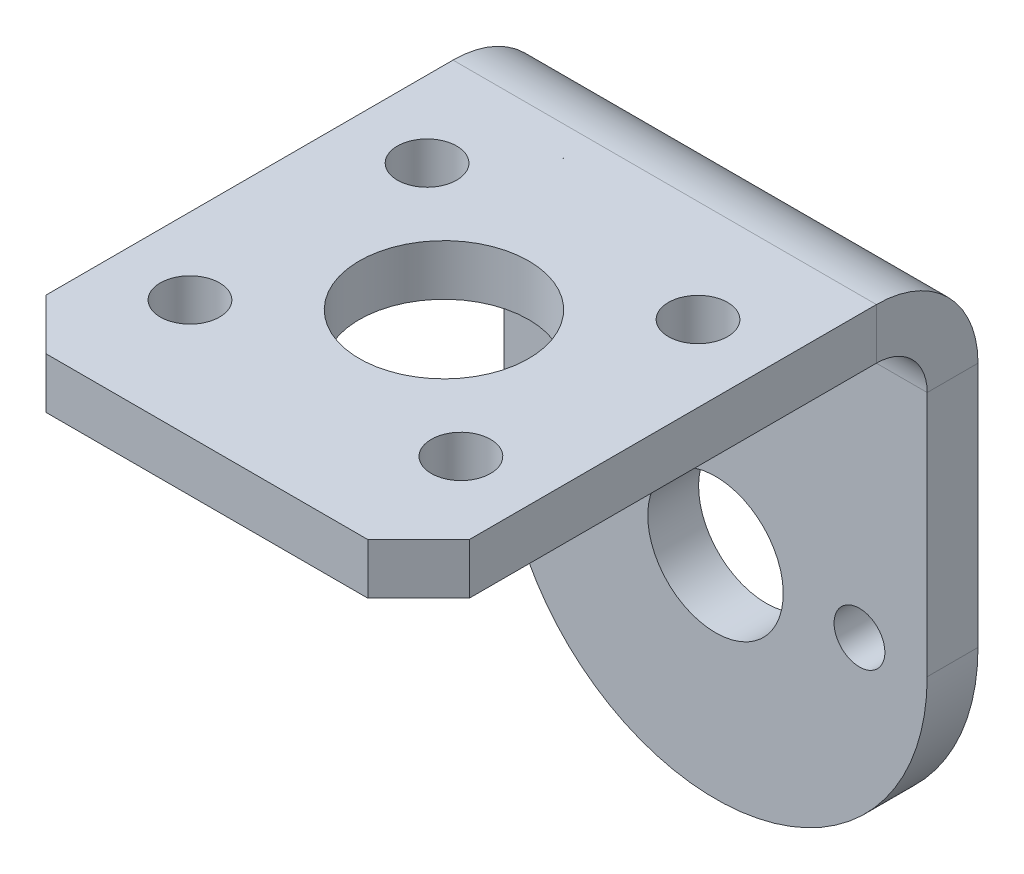
ISO-10303-21;
HEADER;
FILE_DESCRIPTION(('STEP AP214'),'2;1');
FILE_NAME('part.step','',(''),(''),'','','');
FILE_SCHEMA(('AUTOMOTIVE_DESIGN { 1 0 10303 214 1 1 1 1 }'));
ENDSEC;
DATA;
#1=APPLICATION_CONTEXT('core data for automotive mechanical design processes');
#2=APPLICATION_PROTOCOL_DEFINITION('international standard','automotive_design',2000,#1);
#3=PRODUCT_CONTEXT('',#1,'mechanical');
#4=PRODUCT('Part','Part','',(#3));
#5=PRODUCT_RELATED_PRODUCT_CATEGORY('part','',(#4));
#6=PRODUCT_DEFINITION_FORMATION('','',#4);
#7=PRODUCT_DEFINITION_CONTEXT('part definition',#1,'design');
#8=PRODUCT_DEFINITION('design','',#6,#7);
#9=PRODUCT_DEFINITION_SHAPE('','',#8);
#10=(LENGTH_UNIT() NAMED_UNIT(*) SI_UNIT(.MILLI.,.METRE.));
#11=(NAMED_UNIT(*) PLANE_ANGLE_UNIT() SI_UNIT($,.RADIAN.));
#12=(NAMED_UNIT(*) SI_UNIT($,.STERADIAN.) SOLID_ANGLE_UNIT());
#13=UNCERTAINTY_MEASURE_WITH_UNIT(LENGTH_MEASURE(1.E-05),#10,'distance_accuracy_value','');
#14=(GEOMETRIC_REPRESENTATION_CONTEXT(3) GLOBAL_UNCERTAINTY_ASSIGNED_CONTEXT((#13)) GLOBAL_UNIT_ASSIGNED_CONTEXT((#10,
#11,#12)) REPRESENTATION_CONTEXT('',''));
#15=CARTESIAN_POINT('',(0.,0.,0.));
#16=DIRECTION('',(0.,0.,1.));
#17=DIRECTION('',(1.,0.,0.));
#18=AXIS2_PLACEMENT_3D('',#15,#16,#17);
#19=CARTESIAN_POINT('',(30.0870470611948,35.2072130891019,-10.4479249054658));
#20=DIRECTION('',(0.,-1.,0.));
#21=DIRECTION('',(1.,0.,0.));
#22=AXIS2_PLACEMENT_3D('',#19,#20,#21);
#23=PLANE('',#22);
#24=CARTESIAN_POINT('',(30.0870470611941,35.2072130891018,19.034079934123));
#25=DIRECTION('',(0.,1.,0.));
#26=DIRECTION('',(0.,0.,-1.));
#27=AXIS2_PLACEMENT_3D('',#24,#25,#26);
#28=CIRCLE('',#27,4.99999999999994);
#29=CARTESIAN_POINT('',(30.0870470611943,35.2072130891018,14.034079934123));
#30=VERTEX_POINT('',#29);
#31=EDGE_CURVE('E12',#30,#30,#28,.T.);
#32=ORIENTED_EDGE('',*,*,#31,.T.);
#33=EDGE_LOOP('',(#32));
#34=FACE_BOUND('',#33,.T.);
#35=CARTESIAN_POINT('',(22.0870470611939,35.2072130891018,26.0340799341227));
#36=DIRECTION('',(0.,1.,0.));
#37=DIRECTION('',(0.,0.,-1.));
#38=AXIS2_PLACEMENT_3D('',#35,#36,#37);
#39=CIRCLE('',#38,1.75);
#40=CARTESIAN_POINT('',(22.0870470611939,35.2072130891018,24.2840799341228));
#41=VERTEX_POINT('',#40);
#42=EDGE_CURVE('E30',#41,#41,#39,.T.);
#43=ORIENTED_EDGE('',*,*,#42,.T.);
#44=EDGE_LOOP('',(#43));
#45=FACE_BOUND('',#44,.T.);
#46=CARTESIAN_POINT('',(22.0870470611942,35.2072130891018,12.0340799341227));
#47=DIRECTION('',(0.,1.,0.));
#48=DIRECTION('',(0.,0.,-1.));
#49=AXIS2_PLACEMENT_3D('',#46,#47,#48);
#50=CIRCLE('',#49,1.75000000000006);
#51=CARTESIAN_POINT('',(22.0870470611943,35.2072130891018,10.2840799341228));
#52=VERTEX_POINT('',#51);
#53=EDGE_CURVE('E344',#52,#52,#50,.T.);
#54=ORIENTED_EDGE('',*,*,#53,.T.);
#55=EDGE_LOOP('',(#54));
#56=FACE_BOUND('',#55,.T.);
#57=CARTESIAN_POINT('',(38.0870470611939,35.2072130891018,26.0340799341232));
#58=DIRECTION('',(0.,1.,0.));
#59=DIRECTION('',(0.,0.,-1.));
#60=AXIS2_PLACEMENT_3D('',#57,#58,#59);
#61=CIRCLE('',#60,1.74999999999994);
#62=CARTESIAN_POINT('',(38.0870470611939,35.2072130891018,24.2840799341233));
#63=VERTEX_POINT('',#62);
#64=EDGE_CURVE('E354',#63,#63,#61,.T.);
#65=ORIENTED_EDGE('',*,*,#64,.T.);
#66=EDGE_LOOP('',(#65));
#67=FACE_BOUND('',#66,.T.);
#68=CARTESIAN_POINT('',(38.0870470611943,35.2072130891018,12.0340799341233));
#69=DIRECTION('',(0.,1.,0.));
#70=DIRECTION('',(0.,0.,-1.));
#71=AXIS2_PLACEMENT_3D('',#68,#69,#70);
#72=CIRCLE('',#71,1.74999999999994);
#73=CARTESIAN_POINT('',(38.0870470611944,35.2072130891018,10.2840799341233));
#74=VERTEX_POINT('',#73);
#75=EDGE_CURVE('E357',#74,#74,#72,.T.);
#76=ORIENTED_EDGE('',*,*,#75,.T.);
#77=EDGE_LOOP('',(#76));
#78=FACE_BOUND('',#77,.T.);
#79=DIRECTION('',(1.,0.,0.));
#80=VECTOR('',#79,1.);
#81=CARTESIAN_POINT('',(17.5870470611945,35.2072130891019,5.99999999999999));
#82=LINE('',#81,#80);
#83=CARTESIAN_POINT('',(17.5870470611945,35.2072130891019,5.99999999999999));
#84=VERTEX_POINT('',#83);
#85=CARTESIAN_POINT('',(42.5870470611946,35.2072130891019,6.));
#86=VERTEX_POINT('',#85);
#87=EDGE_CURVE('E323',#84,#86,#82,.T.);
#88=ORIENTED_EDGE('',*,*,#87,.T.);
#89=DIRECTION('',(0.,0.,-1.));
#90=VECTOR('',#89,1.);
#91=CARTESIAN_POINT('',(42.5870470611939,35.2072130891018,30.0340799341233));
#92=LINE('',#91,#90);
#93=CARTESIAN_POINT('',(42.5870470611939,35.2072130891018,30.0340799341233));
#94=VERTEX_POINT('',#93);
#95=EDGE_CURVE('E175',#94,#86,#92,.T.);
#96=ORIENTED_EDGE('',*,*,#95,.F.);
#97=DIRECTION('',(0.707106781186582,0.,-0.707106781186513));
#98=VECTOR('',#97,1.);
#99=CARTESIAN_POINT('',(39.5870470611937,35.2072130891018,33.0340799341233));
#100=LINE('',#99,#98);
#101=CARTESIAN_POINT('',(39.5870470611937,35.2072130891018,33.0340799341233));
#102=VERTEX_POINT('',#101);
#103=EDGE_CURVE('E382',#102,#94,#100,.T.);
#104=ORIENTED_EDGE('',*,*,#103,.F.);
#105=DIRECTION('',(1.,0.,0.));
#106=VECTOR('',#105,1.);
#107=CARTESIAN_POINT('',(20.5870470611937,35.2072130891018,33.0340799341228));
#108=LINE('',#107,#106);
#109=CARTESIAN_POINT('',(20.5870470611937,35.2072130891018,33.0340799341228));
#110=VERTEX_POINT('',#109);
#111=EDGE_CURVE('E374',#110,#102,#108,.T.);
#112=ORIENTED_EDGE('',*,*,#111,.F.);
#113=DIRECTION('',(0.707106781186507,0.,0.707106781186588));
#114=VECTOR('',#113,1.);
#115=CARTESIAN_POINT('',(17.5870470611939,35.2072130891018,30.0340799341226));
#116=LINE('',#115,#114);
#117=CARTESIAN_POINT('',(17.5870470611939,35.2072130891018,30.0340799341226));
#118=VERTEX_POINT('',#117);
#119=EDGE_CURVE('E365',#118,#110,#116,.T.);
#120=ORIENTED_EDGE('',*,*,#119,.F.);
#121=DIRECTION('',(0.,0.,1.));
#122=VECTOR('',#121,1.);
#123=CARTESIAN_POINT('',(17.5870470611945,35.2072130891019,5.99999999999999));
#124=LINE('',#123,#122);
#125=EDGE_CURVE('E276',#84,#118,#124,.T.);
#126=ORIENTED_EDGE('',*,*,#125,.F.);
#127=EDGE_LOOP('',(#88,#96,#104,#112,#120,#126));
#128=FACE_BOUND('',#127,.T.);
#129=ADVANCED_FACE('F21',(#34,#45,#56,#67,#78,#128),#23,.T.);
#130=CARTESIAN_POINT('',(30.0870470611941,38.2072130891018,19.034079934123));
#131=DIRECTION('',(0.,1.,0.));
#132=DIRECTION('',(0.,0.,-1.));
#133=AXIS2_PLACEMENT_3D('',#130,#131,#132);
#134=CYLINDRICAL_SURFACE('',#133,4.99999999999994);
#135=CARTESIAN_POINT('',(30.0870470611941,38.2072130891018,19.034079934123));
#136=DIRECTION('',(0.,-1.,0.));
#137=DIRECTION('',(0.,0.,-1.));
#138=AXIS2_PLACEMENT_3D('',#135,#136,#137);
#139=CIRCLE('',#138,4.99999999999994);
#140=CARTESIAN_POINT('',(30.0870470611943,38.2072130891019,14.034079934123));
#141=VERTEX_POINT('',#140);
#142=EDGE_CURVE('E156',#141,#141,#139,.T.);
#143=ORIENTED_EDGE('',*,*,#142,.F.);
#144=EDGE_LOOP('',(#143));
#145=FACE_BOUND('',#144,.T.);
#146=ORIENTED_EDGE('',*,*,#31,.F.);
#147=EDGE_LOOP('',(#146));
#148=FACE_BOUND('',#147,.T.);
#149=ADVANCED_FACE('F501',(#145,#148),#134,.F.);
#150=CARTESIAN_POINT('',(22.0870470611939,38.2072130891018,26.0340799341227));
#151=DIRECTION('',(0.,1.,0.));
#152=DIRECTION('',(0.,0.,-1.));
#153=AXIS2_PLACEMENT_3D('',#150,#151,#152);
#154=CYLINDRICAL_SURFACE('',#153,1.75);
#155=CARTESIAN_POINT('',(22.0870470611939,38.2072130891018,26.0340799341227));
#156=DIRECTION('',(0.,-1.,0.));
#157=DIRECTION('',(0.,0.,-1.));
#158=AXIS2_PLACEMENT_3D('',#155,#156,#157);
#159=CIRCLE('',#158,1.75);
#160=CARTESIAN_POINT('',(22.0870470611939,38.2072130891018,24.2840799341228));
#161=VERTEX_POINT('',#160);
#162=EDGE_CURVE('E292',#161,#161,#159,.T.);
#163=ORIENTED_EDGE('',*,*,#162,.F.);
#164=EDGE_LOOP('',(#163));
#165=FACE_BOUND('',#164,.T.);
#166=ORIENTED_EDGE('',*,*,#42,.F.);
#167=EDGE_LOOP('',(#166));
#168=FACE_BOUND('',#167,.T.);
#169=ADVANCED_FACE('F529',(#165,#168),#154,.F.);
#170=CARTESIAN_POINT('',(22.0870470611942,38.2072130891019,12.0340799341227));
#171=DIRECTION('',(0.,1.,0.));
#172=DIRECTION('',(0.,0.,-1.));
#173=AXIS2_PLACEMENT_3D('',#170,#171,#172);
#174=CYLINDRICAL_SURFACE('',#173,1.75000000000006);
#175=CARTESIAN_POINT('',(22.0870470611942,38.2072130891019,12.0340799341227));
#176=DIRECTION('',(0.,-1.,0.));
#177=DIRECTION('',(0.,0.,-1.));
#178=AXIS2_PLACEMENT_3D('',#175,#176,#177);
#179=CIRCLE('',#178,1.75000000000006);
#180=CARTESIAN_POINT('',(22.0870470611943,38.2072130891019,10.2840799341228));
#181=VERTEX_POINT('',#180);
#182=EDGE_CURVE('E289',#181,#181,#179,.T.);
#183=ORIENTED_EDGE('',*,*,#182,.F.);
#184=EDGE_LOOP('',(#183));
#185=FACE_BOUND('',#184,.T.);
#186=ORIENTED_EDGE('',*,*,#53,.F.);
#187=EDGE_LOOP('',(#186));
#188=FACE_BOUND('',#187,.T.);
#189=ADVANCED_FACE('F495',(#185,#188),#174,.F.);
#190=CARTESIAN_POINT('',(38.0870470611939,38.2072130891018,26.0340799341232));
#191=DIRECTION('',(0.,1.,0.));
#192=DIRECTION('',(0.,0.,-1.));
#193=AXIS2_PLACEMENT_3D('',#190,#191,#192);
#194=CYLINDRICAL_SURFACE('',#193,1.74999999999994);
#195=CARTESIAN_POINT('',(38.0870470611939,38.2072130891018,26.0340799341232));
#196=DIRECTION('',(0.,-1.,0.));
#197=DIRECTION('',(0.,0.,-1.));
#198=AXIS2_PLACEMENT_3D('',#195,#196,#197);
#199=CIRCLE('',#198,1.74999999999994);
#200=CARTESIAN_POINT('',(38.0870470611939,38.2072130891018,24.2840799341233));
#201=VERTEX_POINT('',#200);
#202=EDGE_CURVE('E277',#201,#201,#199,.T.);
#203=ORIENTED_EDGE('',*,*,#202,.F.);
#204=EDGE_LOOP('',(#203));
#205=FACE_BOUND('',#204,.T.);
#206=ORIENTED_EDGE('',*,*,#64,.F.);
#207=EDGE_LOOP('',(#206));
#208=FACE_BOUND('',#207,.T.);
#209=ADVANCED_FACE('F491',(#205,#208),#194,.F.);
#210=CARTESIAN_POINT('',(38.0870470611943,38.2072130891019,12.0340799341233));
#211=DIRECTION('',(0.,1.,0.));
#212=DIRECTION('',(0.,0.,-1.));
#213=AXIS2_PLACEMENT_3D('',#210,#211,#212);
#214=CYLINDRICAL_SURFACE('',#213,1.74999999999994);
#215=CARTESIAN_POINT('',(38.0870470611943,38.2072130891019,12.0340799341233));
#216=DIRECTION('',(0.,-1.,0.));
#217=DIRECTION('',(0.,0.,-1.));
#218=AXIS2_PLACEMENT_3D('',#215,#216,#217);
#219=CIRCLE('',#218,1.74999999999994);
#220=CARTESIAN_POINT('',(38.0870470611944,38.2072130891019,10.2840799341233));
#221=VERTEX_POINT('',#220);
#222=EDGE_CURVE('E272',#221,#221,#219,.T.);
#223=ORIENTED_EDGE('',*,*,#222,.F.);
#224=EDGE_LOOP('',(#223));
#225=FACE_BOUND('',#224,.T.);
#226=ORIENTED_EDGE('',*,*,#75,.F.);
#227=EDGE_LOOP('',(#226));
#228=FACE_BOUND('',#227,.T.);
#229=ADVANCED_FACE('F494',(#225,#228),#214,.F.);
#230=CARTESIAN_POINT('',(17.5870470611939,38.2072130891018,30.0340799341226));
#231=DIRECTION('',(-0.707106781186588,0.,0.707106781186507));
#232=DIRECTION('',(0.,-1.,0.));
#233=AXIS2_PLACEMENT_3D('',#230,#231,#232);
#234=PLANE('',#233);
#235=ORIENTED_EDGE('',*,*,#119,.T.);
#236=DIRECTION('',(0.,-1.,0.));
#237=VECTOR('',#236,1.);
#238=CARTESIAN_POINT('',(20.5870470611937,38.2072130891018,33.0340799341228));
#239=LINE('',#238,#237);
#240=CARTESIAN_POINT('',(20.5870470611937,38.2072130891018,33.0340799341228));
#241=VERTEX_POINT('',#240);
#242=EDGE_CURVE('E369',#241,#110,#239,.T.);
#243=ORIENTED_EDGE('',*,*,#242,.F.);
#244=DIRECTION('',(-0.707106781186507,0.,-0.707106781186588));
#245=VECTOR('',#244,1.);
#246=CARTESIAN_POINT('',(20.5870470611937,38.2072130891018,33.0340799341228));
#247=LINE('',#246,#245);
#248=CARTESIAN_POINT('',(17.5870470611939,38.2072130891018,30.0340799341226));
#249=VERTEX_POINT('',#248);
#250=EDGE_CURVE('E479',#241,#249,#247,.T.);
#251=ORIENTED_EDGE('',*,*,#250,.T.);
#252=DIRECTION('',(0.,-1.,0.));
#253=VECTOR('',#252,1.);
#254=CARTESIAN_POINT('',(17.5870470611939,38.2072130891018,30.0340799341226));
#255=LINE('',#254,#253);
#256=EDGE_CURVE('E438',#249,#118,#255,.T.);
#257=ORIENTED_EDGE('',*,*,#256,.T.);
#258=EDGE_LOOP('',(#235,#243,#251,#257));
#259=FACE_BOUND('',#258,.T.);
#260=ADVANCED_FACE('F514',(#259),#234,.T.);
#261=CARTESIAN_POINT('',(20.5870470611937,38.2072130891018,33.0340799341228));
#262=DIRECTION('',(0.,0.,1.));
#263=DIRECTION('',(0.,-1.,0.));
#264=AXIS2_PLACEMENT_3D('',#261,#262,#263);
#265=PLANE('',#264);
#266=ORIENTED_EDGE('',*,*,#111,.T.);
#267=DIRECTION('',(0.,-1.,0.));
#268=VECTOR('',#267,1.);
#269=CARTESIAN_POINT('',(39.5870470611937,38.2072130891018,33.0340799341233));
#270=LINE('',#269,#268);
#271=CARTESIAN_POINT('',(39.5870470611937,38.2072130891018,33.0340799341233));
#272=VERTEX_POINT('',#271);
#273=EDGE_CURVE('E378',#272,#102,#270,.T.);
#274=ORIENTED_EDGE('',*,*,#273,.F.);
#275=DIRECTION('',(-1.,0.,0.));
#276=VECTOR('',#275,1.);
#277=CARTESIAN_POINT('',(39.5870470611937,38.2072130891018,33.0340799341233));
#278=LINE('',#277,#276);
#279=EDGE_CURVE('E481',#272,#241,#278,.T.);
#280=ORIENTED_EDGE('',*,*,#279,.T.);
#281=ORIENTED_EDGE('',*,*,#242,.T.);
#282=EDGE_LOOP('',(#266,#274,#280,#281));
#283=FACE_BOUND('',#282,.T.);
#284=ADVANCED_FACE('F509',(#283),#265,.T.);
#285=CARTESIAN_POINT('',(39.5870470611937,38.2072130891018,33.0340799341233));
#286=DIRECTION('',(0.707106781186513,0.,0.707106781186582));
#287=DIRECTION('',(0.,1.,0.));
#288=AXIS2_PLACEMENT_3D('',#285,#286,#287);
#289=PLANE('',#288);
#290=ORIENTED_EDGE('',*,*,#103,.T.);
#291=DIRECTION('',(0.,-1.,0.));
#292=VECTOR('',#291,1.);
#293=CARTESIAN_POINT('',(42.5870470611939,38.2072130891018,30.0340799341233));
#294=LINE('',#293,#292);
#295=CARTESIAN_POINT('',(42.5870470611939,38.2072130891018,30.0340799341233));
#296=VERTEX_POINT('',#295);
#297=EDGE_CURVE('E390',#296,#94,#294,.T.);
#298=ORIENTED_EDGE('',*,*,#297,.F.);
#299=DIRECTION('',(-0.707106781186582,0.,0.707106781186513));
#300=VECTOR('',#299,1.);
#301=CARTESIAN_POINT('',(42.5870470611939,38.2072130891018,30.0340799341233));
#302=LINE('',#301,#300);
#303=EDGE_CURVE('E151',#296,#272,#302,.T.);
#304=ORIENTED_EDGE('',*,*,#303,.T.);
#305=ORIENTED_EDGE('',*,*,#273,.T.);
#306=EDGE_LOOP('',(#290,#298,#304,#305));
#307=FACE_BOUND('',#306,.T.);
#308=ADVANCED_FACE('F513',(#307),#289,.T.);
#309=CARTESIAN_POINT('',(42.587047061194,38.2072130891019,2.60708911712294));
#310=DIRECTION('',(1.,0.,0.));
#311=DIRECTION('',(0.,1.,0.));
#312=AXIS2_PLACEMENT_3D('',#309,#310,#311);
#313=PLANE('',#312);
#314=DIRECTION('',(0.,1.,0.));
#315=VECTOR('',#314,1.);
#316=CARTESIAN_POINT('',(42.5870470611946,35.2072130891019,6.));
#317=LINE('',#316,#315);
#318=CARTESIAN_POINT('',(42.5870470611946,38.2072130891019,6.));
#319=VERTEX_POINT('',#318);
#320=EDGE_CURVE('E172',#86,#319,#317,.T.);
#321=ORIENTED_EDGE('',*,*,#320,.T.);
#322=DIRECTION('',(0.,0.,1.));
#323=VECTOR('',#322,1.);
#324=CARTESIAN_POINT('',(42.5870470611946,38.2072130891019,6.));
#325=LINE('',#324,#323);
#326=EDGE_CURVE('E143',#319,#296,#325,.T.);
#327=ORIENTED_EDGE('',*,*,#326,.T.);
#328=ORIENTED_EDGE('',*,*,#297,.T.);
#329=ORIENTED_EDGE('',*,*,#95,.T.);
#330=EDGE_LOOP('',(#321,#327,#328,#329));
#331=FACE_BOUND('',#330,.T.);
#332=ADVANCED_FACE('F173',(#331),#313,.T.);
#333=CARTESIAN_POINT('',(17.5870470611951,38.2072130891019,-15.3199016998773));
#334=DIRECTION('',(-1.,0.,0.));
#335=DIRECTION('',(0.,-1.,0.));
#336=AXIS2_PLACEMENT_3D('',#333,#334,#335);
#337=PLANE('',#336);
#338=DIRECTION('',(0.,-1.,0.));
#339=VECTOR('',#338,1.);
#340=CARTESIAN_POINT('',(17.5870470611945,38.2072130891019,5.99999999999999));
#341=LINE('',#340,#339);
#342=CARTESIAN_POINT('',(17.5870470611945,38.2072130891019,5.99999999999999));
#343=VERTEX_POINT('',#342);
#344=EDGE_CURVE('E169',#343,#84,#341,.T.);
#345=ORIENTED_EDGE('',*,*,#344,.T.);
#346=ORIENTED_EDGE('',*,*,#125,.T.);
#347=ORIENTED_EDGE('',*,*,#256,.F.);
#348=DIRECTION('',(0.,0.,-1.));
#349=VECTOR('',#348,1.);
#350=CARTESIAN_POINT('',(17.5870470611939,38.2072130891018,30.0340799341226));
#351=LINE('',#350,#349);
#352=EDGE_CURVE('E430',#249,#343,#351,.T.);
#353=ORIENTED_EDGE('',*,*,#352,.T.);
#354=EDGE_LOOP('',(#345,#346,#347,#353));
#355=FACE_BOUND('',#354,.T.);
#356=ADVANCED_FACE('F449',(#355),#337,.T.);
#357=CARTESIAN_POINT('',(30.0870470611948,38.2072130891019,-10.4479249054658));
#358=DIRECTION('',(0.,1.,0.));
#359=DIRECTION('',(1.,0.,0.));
#360=AXIS2_PLACEMENT_3D('',#357,#358,#359);
#361=PLANE('',#360);
#362=ORIENTED_EDGE('',*,*,#222,.T.);
#363=EDGE_LOOP('',(#362));
#364=FACE_BOUND('',#363,.T.);
#365=ORIENTED_EDGE('',*,*,#202,.T.);
#366=EDGE_LOOP('',(#365));
#367=FACE_BOUND('',#366,.T.);
#368=ORIENTED_EDGE('',*,*,#182,.T.);
#369=EDGE_LOOP('',(#368));
#370=FACE_BOUND('',#369,.T.);
#371=ORIENTED_EDGE('',*,*,#162,.T.);
#372=EDGE_LOOP('',(#371));
#373=FACE_BOUND('',#372,.T.);
#374=ORIENTED_EDGE('',*,*,#142,.T.);
#375=EDGE_LOOP('',(#374));
#376=FACE_BOUND('',#375,.T.);
#377=DIRECTION('',(-1.,0.,0.));
#378=VECTOR('',#377,1.);
#379=CARTESIAN_POINT('',(42.5870470611946,38.2072130891019,6.));
#380=LINE('',#379,#378);
#381=EDGE_CURVE('E147',#319,#343,#380,.T.);
#382=ORIENTED_EDGE('',*,*,#381,.T.);
#383=ORIENTED_EDGE('',*,*,#352,.F.);
#384=ORIENTED_EDGE('',*,*,#250,.F.);
#385=ORIENTED_EDGE('',*,*,#279,.F.);
#386=ORIENTED_EDGE('',*,*,#303,.F.);
#387=ORIENTED_EDGE('',*,*,#326,.F.);
#388=EDGE_LOOP('',(#382,#383,#384,#385,#386,#387));
#389=FACE_BOUND('',#388,.T.);
#390=ADVANCED_FACE('F145',(#364,#367,#370,#373,#376,#389),#361,.T.);
#391=CARTESIAN_POINT('',(30.0870470611951,17.6731515209788,0.));
#392=DIRECTION('',(0.,0.,1.));
#393=DIRECTION('',(-1.,0.,0.));
#394=AXIS2_PLACEMENT_3D('',#391,#392,#393);
#395=CYLINDRICAL_SURFACE('',#394,12.5);
#396=CARTESIAN_POINT('',(30.0870470611951,17.6731515209788,3.));
#397=DIRECTION('',(0.,0.,-1.));
#398=DIRECTION('',(-1.,0.,0.));
#399=AXIS2_PLACEMENT_3D('',#396,#397,#398);
#400=CIRCLE('',#399,12.5);
#401=CARTESIAN_POINT('',(42.5870470611951,17.6731515209792,3.));
#402=VERTEX_POINT('',#401);
#403=CARTESIAN_POINT('',(17.5870470611951,17.6731515209785,3.));
#404=VERTEX_POINT('',#403);
#405=EDGE_CURVE('E205',#402,#404,#400,.T.);
#406=ORIENTED_EDGE('',*,*,#405,.T.);
#407=DIRECTION('',(0.,0.,1.));
#408=VECTOR('',#407,1.);
#409=CARTESIAN_POINT('',(17.5870470611951,17.6731515209785,0.));
#410=LINE('',#409,#408);
#411=CARTESIAN_POINT('',(17.5870470611951,17.6731515209785,0.));
#412=VERTEX_POINT('',#411);
#413=EDGE_CURVE('E403',#412,#404,#410,.T.);
#414=ORIENTED_EDGE('',*,*,#413,.F.);
#415=CARTESIAN_POINT('',(30.0870470611951,17.6731515209788,0.));
#416=DIRECTION('',(0.,0.,1.));
#417=DIRECTION('',(-1.,0.,0.));
#418=AXIS2_PLACEMENT_3D('',#415,#416,#417);
#419=CIRCLE('',#418,12.5);
#420=CARTESIAN_POINT('',(42.5870470611951,17.6731515209792,0.));
#421=VERTEX_POINT('',#420);
#422=EDGE_CURVE('E474',#412,#421,#419,.T.);
#423=ORIENTED_EDGE('',*,*,#422,.T.);
#424=DIRECTION('',(0.,0.,1.));
#425=VECTOR('',#424,1.);
#426=CARTESIAN_POINT('',(42.5870470611951,17.6731515209792,0.));
#427=LINE('',#426,#425);
#428=EDGE_CURVE('E426',#421,#402,#427,.T.);
#429=ORIENTED_EDGE('',*,*,#428,.T.);
#430=EDGE_LOOP('',(#406,#414,#423,#429));
#431=FACE_BOUND('',#430,.T.);
#432=ADVANCED_FACE('F541',(#431),#395,.T.);
#433=CARTESIAN_POINT('',(38.5870470611949,17.6731515209791,0.));
#434=DIRECTION('',(0.,0.,-1.));
#435=DIRECTION('',(0.,-1.,0.));
#436=AXIS2_PLACEMENT_3D('',#433,#434,#435);
#437=CYLINDRICAL_SURFACE('',#436,1.5);
#438=CARTESIAN_POINT('',(38.5870470611949,17.6731515209791,0.));
#439=DIRECTION('',(0.,0.,1.));
#440=DIRECTION('',(0.,-1.,0.));
#441=AXIS2_PLACEMENT_3D('',#438,#439,#440);
#442=CIRCLE('',#441,1.5);
#443=CARTESIAN_POINT('',(38.5870470611951,16.1731515209791,0.));
#444=VERTEX_POINT('',#443);
#445=EDGE_CURVE('E420',#444,#444,#442,.T.);
#446=ORIENTED_EDGE('',*,*,#445,.F.);
#447=EDGE_LOOP('',(#446));
#448=FACE_BOUND('',#447,.T.);
#449=CARTESIAN_POINT('',(38.5870470611949,17.6731515209791,3.));
#450=DIRECTION('',(0.,0.,-1.));
#451=DIRECTION('',(0.,-1.,0.));
#452=AXIS2_PLACEMENT_3D('',#449,#450,#451);
#453=CIRCLE('',#452,1.5);
#454=CARTESIAN_POINT('',(38.5870470611951,16.1731515209791,3.));
#455=VERTEX_POINT('',#454);
#456=EDGE_CURVE('E222',#455,#455,#453,.T.);
#457=ORIENTED_EDGE('',*,*,#456,.F.);
#458=EDGE_LOOP('',(#457));
#459=FACE_BOUND('',#458,.T.);
#460=ADVANCED_FACE('F548',(#448,#459),#437,.F.);
#461=CARTESIAN_POINT('',(21.5870470611951,17.6731515209786,0.));
#462=DIRECTION('',(0.,0.,-1.));
#463=DIRECTION('',(0.,-1.,0.));
#464=AXIS2_PLACEMENT_3D('',#461,#462,#463);
#465=CYLINDRICAL_SURFACE('',#464,1.5);
#466=CARTESIAN_POINT('',(21.5870470611951,17.6731515209786,0.));
#467=DIRECTION('',(0.,0.,1.));
#468=DIRECTION('',(0.,-1.,0.));
#469=AXIS2_PLACEMENT_3D('',#466,#467,#468);
#470=CIRCLE('',#469,1.5);
#471=CARTESIAN_POINT('',(21.5870470611951,16.1731515209786,0.));
#472=VERTEX_POINT('',#471);
#473=EDGE_CURVE('E417',#472,#472,#470,.T.);
#474=ORIENTED_EDGE('',*,*,#473,.F.);
#475=EDGE_LOOP('',(#474));
#476=FACE_BOUND('',#475,.T.);
#477=CARTESIAN_POINT('',(21.5870470611951,17.6731515209786,3.));
#478=DIRECTION('',(0.,0.,-1.));
#479=DIRECTION('',(0.,-1.,0.));
#480=AXIS2_PLACEMENT_3D('',#477,#478,#479);
#481=CIRCLE('',#480,1.5);
#482=CARTESIAN_POINT('',(21.5870470611951,16.1731515209786,3.));
#483=VERTEX_POINT('',#482);
#484=EDGE_CURVE('E227',#483,#483,#481,.T.);
#485=ORIENTED_EDGE('',*,*,#484,.F.);
#486=EDGE_LOOP('',(#485));
#487=FACE_BOUND('',#486,.T.);
#488=ADVANCED_FACE('F586',(#476,#487),#465,.F.);
#489=CARTESIAN_POINT('',(30.0870470611951,17.6731515209788,0.));
#490=DIRECTION('',(0.,0.,-1.));
#491=DIRECTION('',(0.,-1.,0.));
#492=AXIS2_PLACEMENT_3D('',#489,#490,#491);
#493=CYLINDRICAL_SURFACE('',#492,4.00000000000003);
#494=CARTESIAN_POINT('',(30.0870470611951,17.6731515209788,0.));
#495=DIRECTION('',(0.,0.,1.));
#496=DIRECTION('',(0.,-1.,0.));
#497=AXIS2_PLACEMENT_3D('',#494,#495,#496);
#498=CIRCLE('',#497,4.00000000000003);
#499=CARTESIAN_POINT('',(30.0870470611952,13.6731515209788,0.));
#500=VERTEX_POINT('',#499);
#501=EDGE_CURVE('E421',#500,#500,#498,.T.);
#502=ORIENTED_EDGE('',*,*,#501,.F.);
#503=EDGE_LOOP('',(#502));
#504=FACE_BOUND('',#503,.T.);
#505=CARTESIAN_POINT('',(30.0870470611951,17.6731515209788,3.));
#506=DIRECTION('',(0.,0.,-1.));
#507=DIRECTION('',(0.,-1.,0.));
#508=AXIS2_PLACEMENT_3D('',#505,#506,#507);
#509=CIRCLE('',#508,4.00000000000003);
#510=CARTESIAN_POINT('',(30.0870470611952,13.6731515209788,3.));
#511=VERTEX_POINT('',#510);
#512=EDGE_CURVE('E239',#511,#511,#509,.T.);
#513=ORIENTED_EDGE('',*,*,#512,.F.);
#514=EDGE_LOOP('',(#513));
#515=FACE_BOUND('',#514,.T.);
#516=ADVANCED_FACE('F594',(#504,#515),#493,.F.);
#517=CARTESIAN_POINT('',(42.587047061194,35.6001423379788,0.));
#518=DIRECTION('',(1.,0.,0.));
#519=DIRECTION('',(0.,0.,-1.));
#520=AXIS2_PLACEMENT_3D('',#517,#518,#519);
#521=PLANE('',#520);
#522=DIRECTION('',(0.,0.,1.));
#523=VECTOR('',#522,1.);
#524=CARTESIAN_POINT('',(42.5870470611947,32.2072130891018,0.));
#525=LINE('',#524,#523);
#526=CARTESIAN_POINT('',(42.5870470611947,32.2072130891018,0.));
#527=VERTEX_POINT('',#526);
#528=CARTESIAN_POINT('',(42.5870470611947,32.2072130891018,3.));
#529=VERTEX_POINT('',#528);
#530=EDGE_CURVE('E185',#527,#529,#525,.T.);
#531=ORIENTED_EDGE('',*,*,#530,.T.);
#532=DIRECTION('',(0.,-1.,0.));
#533=VECTOR('',#532,1.);
#534=CARTESIAN_POINT('',(42.5870470611947,32.2072130891018,3.));
#535=LINE('',#534,#533);
#536=EDGE_CURVE('E210',#529,#402,#535,.T.);
#537=ORIENTED_EDGE('',*,*,#536,.T.);
#538=ORIENTED_EDGE('',*,*,#428,.F.);
#539=DIRECTION('',(0.,1.,0.));
#540=VECTOR('',#539,1.);
#541=CARTESIAN_POINT('',(42.5870470611951,17.6731515209792,0.));
#542=LINE('',#541,#540);
#543=EDGE_CURVE('E226',#421,#527,#542,.T.);
#544=ORIENTED_EDGE('',*,*,#543,.T.);
#545=EDGE_LOOP('',(#531,#537,#538,#544));
#546=FACE_BOUND('',#545,.T.);
#547=ADVANCED_FACE('F603',(#546),#521,.T.);
#548=CARTESIAN_POINT('',(30.0870470611948,22.54512831539,0.));
#549=DIRECTION('',(0.,0.,-1.));
#550=DIRECTION('',(1.,0.,0.));
#551=AXIS2_PLACEMENT_3D('',#548,#549,#550);
#552=PLANE('',#551);
#553=ORIENTED_EDGE('',*,*,#445,.T.);
#554=EDGE_LOOP('',(#553));
#555=FACE_BOUND('',#554,.T.);
#556=ORIENTED_EDGE('',*,*,#473,.T.);
#557=EDGE_LOOP('',(#556));
#558=FACE_BOUND('',#557,.T.);
#559=ORIENTED_EDGE('',*,*,#501,.T.);
#560=EDGE_LOOP('',(#559));
#561=FACE_BOUND('',#560,.T.);
#562=DIRECTION('',(1.,0.,0.));
#563=VECTOR('',#562,1.);
#564=CARTESIAN_POINT('',(17.5870470611947,32.2072130891018,0.));
#565=LINE('',#564,#563);
#566=CARTESIAN_POINT('',(17.5870470611947,32.2072130891018,0.));
#567=VERTEX_POINT('',#566);
#568=EDGE_CURVE('E168',#567,#527,#565,.T.);
#569=ORIENTED_EDGE('',*,*,#568,.T.);
#570=ORIENTED_EDGE('',*,*,#543,.F.);
#571=ORIENTED_EDGE('',*,*,#422,.F.);
#572=DIRECTION('',(0.,-1.,0.));
#573=VECTOR('',#572,1.);
#574=CARTESIAN_POINT('',(17.5870470611947,32.2072130891018,0.));
#575=LINE('',#574,#573);
#576=EDGE_CURVE('E329',#567,#412,#575,.T.);
#577=ORIENTED_EDGE('',*,*,#576,.F.);
#578=EDGE_LOOP('',(#569,#570,#571,#577));
#579=FACE_BOUND('',#578,.T.);
#580=ADVANCED_FACE('F612',(#555,#558,#561,#579),#552,.T.);
#581=CARTESIAN_POINT('',(30.0870470611948,22.54512831539,3.));
#582=DIRECTION('',(0.,0.,1.));
#583=DIRECTION('',(1.,0.,0.));
#584=AXIS2_PLACEMENT_3D('',#581,#582,#583);
#585=PLANE('',#584);
#586=ORIENTED_EDGE('',*,*,#456,.T.);
#587=EDGE_LOOP('',(#586));
#588=FACE_BOUND('',#587,.T.);
#589=ORIENTED_EDGE('',*,*,#484,.T.);
#590=EDGE_LOOP('',(#589));
#591=FACE_BOUND('',#590,.T.);
#592=ORIENTED_EDGE('',*,*,#512,.T.);
#593=EDGE_LOOP('',(#592));
#594=FACE_BOUND('',#593,.T.);
#595=DIRECTION('',(-1.,0.,0.));
#596=VECTOR('',#595,1.);
#597=CARTESIAN_POINT('',(42.5870470611947,32.2072130891018,3.));
#598=LINE('',#597,#596);
#599=CARTESIAN_POINT('',(17.5870470611947,32.2072130891018,3.));
#600=VERTEX_POINT('',#599);
#601=EDGE_CURVE('E318',#529,#600,#598,.T.);
#602=ORIENTED_EDGE('',*,*,#601,.T.);
#603=DIRECTION('',(0.,1.,0.));
#604=VECTOR('',#603,1.);
#605=CARTESIAN_POINT('',(17.5870470611951,17.6731515209785,3.));
#606=LINE('',#605,#604);
#607=EDGE_CURVE('E211',#404,#600,#606,.T.);
#608=ORIENTED_EDGE('',*,*,#607,.F.);
#609=ORIENTED_EDGE('',*,*,#405,.F.);
#610=ORIENTED_EDGE('',*,*,#536,.F.);
#611=EDGE_LOOP('',(#602,#608,#609,#610));
#612=FACE_BOUND('',#611,.T.);
#613=ADVANCED_FACE('F621',(#588,#591,#594,#612),#585,.T.);
#614=CARTESIAN_POINT('',(17.5870470611951,17.6731515209785,0.));
#615=DIRECTION('',(-1.,0.,0.));
#616=DIRECTION('',(0.,0.,1.));
#617=AXIS2_PLACEMENT_3D('',#614,#615,#616);
#618=PLANE('',#617);
#619=DIRECTION('',(0.,0.,-1.));
#620=VECTOR('',#619,1.);
#621=CARTESIAN_POINT('',(17.5870470611947,32.2072130891018,3.));
#622=LINE('',#621,#620);
#623=EDGE_CURVE('E251',#600,#567,#622,.T.);
#624=ORIENTED_EDGE('',*,*,#623,.T.);
#625=ORIENTED_EDGE('',*,*,#576,.T.);
#626=ORIENTED_EDGE('',*,*,#413,.T.);
#627=ORIENTED_EDGE('',*,*,#607,.T.);
#628=EDGE_LOOP('',(#624,#625,#626,#627));
#629=FACE_BOUND('',#628,.T.);
#630=ADVANCED_FACE('F630',(#629),#618,.T.);
#631=CARTESIAN_POINT('',(30.0870470611946,32.2072130891018,6.));
#632=DIRECTION('',(-1.,0.,0.));
#633=DIRECTION('',(0.,0.,-1.));
#634=AXIS2_PLACEMENT_3D('',#631,#632,#633);
#635=CYLINDRICAL_SURFACE('',#634,3.);
#636=CARTESIAN_POINT('',(17.5870470611947,32.2072130891018,6.));
#637=DIRECTION('',(-1.,0.,0.));
#638=DIRECTION('',(0.,0.,-1.));
#639=AXIS2_PLACEMENT_3D('',#636,#637,#638);
#640=CIRCLE('',#639,3.);
#641=EDGE_CURVE('E246',#84,#600,#640,.T.);
#642=ORIENTED_EDGE('',*,*,#641,.T.);
#643=ORIENTED_EDGE('',*,*,#601,.F.);
#644=CARTESIAN_POINT('',(42.5870470611946,32.2072130891018,6.));
#645=DIRECTION('',(1.,0.,0.));
#646=DIRECTION('',(0.,0.,-1.));
#647=AXIS2_PLACEMENT_3D('',#644,#645,#646);
#648=CIRCLE('',#647,3.);
#649=EDGE_CURVE('E180',#529,#86,#648,.T.);
#650=ORIENTED_EDGE('',*,*,#649,.T.);
#651=ORIENTED_EDGE('',*,*,#87,.F.);
#652=EDGE_LOOP('',(#642,#643,#650,#651));
#653=FACE_BOUND('',#652,.T.);
#654=ADVANCED_FACE('F456',(#653),#635,.F.);
#655=CARTESIAN_POINT('',(30.0870470611946,32.2072130891018,6.));
#656=DIRECTION('',(1.,0.,0.));
#657=DIRECTION('',(0.,0.,-1.));
#658=AXIS2_PLACEMENT_3D('',#655,#656,#657);
#659=CYLINDRICAL_SURFACE('',#658,6.);
#660=CARTESIAN_POINT('',(17.5870470611947,32.2072130891018,6.));
#661=DIRECTION('',(1.,0.,0.));
#662=DIRECTION('',(0.,0.,-1.));
#663=AXIS2_PLACEMENT_3D('',#660,#661,#662);
#664=CIRCLE('',#663,6.);
#665=EDGE_CURVE('E166',#567,#343,#664,.T.);
#666=ORIENTED_EDGE('',*,*,#665,.T.);
#667=ORIENTED_EDGE('',*,*,#381,.F.);
#668=CARTESIAN_POINT('',(42.5870470611946,32.2072130891018,6.));
#669=DIRECTION('',(-1.,0.,0.));
#670=DIRECTION('',(0.,0.,-1.));
#671=AXIS2_PLACEMENT_3D('',#668,#669,#670);
#672=CIRCLE('',#671,6.);
#673=EDGE_CURVE('E164',#319,#527,#672,.T.);
#674=ORIENTED_EDGE('',*,*,#673,.T.);
#675=ORIENTED_EDGE('',*,*,#568,.F.);
#676=EDGE_LOOP('',(#666,#667,#674,#675));
#677=FACE_BOUND('',#676,.T.);
#678=ADVANCED_FACE('F161',(#677),#659,.T.);
#679=CARTESIAN_POINT('',(17.5870470611947,32.2072130891018,-5.25));
#680=DIRECTION('',(-1.,0.,0.));
#681=DIRECTION('',(0.,0.,-1.));
#682=AXIS2_PLACEMENT_3D('',#679,#680,#681);
#683=PLANE('',#682);
#684=ORIENTED_EDGE('',*,*,#665,.F.);
#685=ORIENTED_EDGE('',*,*,#623,.F.);
#686=ORIENTED_EDGE('',*,*,#641,.F.);
#687=ORIENTED_EDGE('',*,*,#344,.F.);
#688=EDGE_LOOP('',(#684,#685,#686,#687));
#689=FACE_BOUND('',#688,.T.);
#690=ADVANCED_FACE('F654',(#689),#683,.T.);
#691=CARTESIAN_POINT('',(42.5870470611946,43.4572130891019,6.00000000000001));
#692=DIRECTION('',(1.,0.,0.));
#693=DIRECTION('',(0.,0.,1.));
#694=AXIS2_PLACEMENT_3D('',#691,#692,#693);
#695=PLANE('',#694);
#696=ORIENTED_EDGE('',*,*,#673,.F.);
#697=ORIENTED_EDGE('',*,*,#320,.F.);
#698=ORIENTED_EDGE('',*,*,#649,.F.);
#699=ORIENTED_EDGE('',*,*,#530,.F.);
#700=EDGE_LOOP('',(#696,#697,#698,#699));
#701=FACE_BOUND('',#700,.T.);
#702=ADVANCED_FACE('F183',(#701),#695,.T.);
#703=CLOSED_SHELL('',(#129,#149,#169,#189,#209,#229,#260,#284,#308,#332,#356,#390,#432,#460,
#488,#516,#547,#580,#613,#630,#654,#678,#690,#702));
#704=MANIFOLD_SOLID_BREP('B1',#703);
#705=ADVANCED_BREP_SHAPE_REPRESENTATION('',(#18,#704),#14);
#706=SHAPE_DEFINITION_REPRESENTATION(#9,#705);
ENDSEC;
END-ISO-10303-21;
